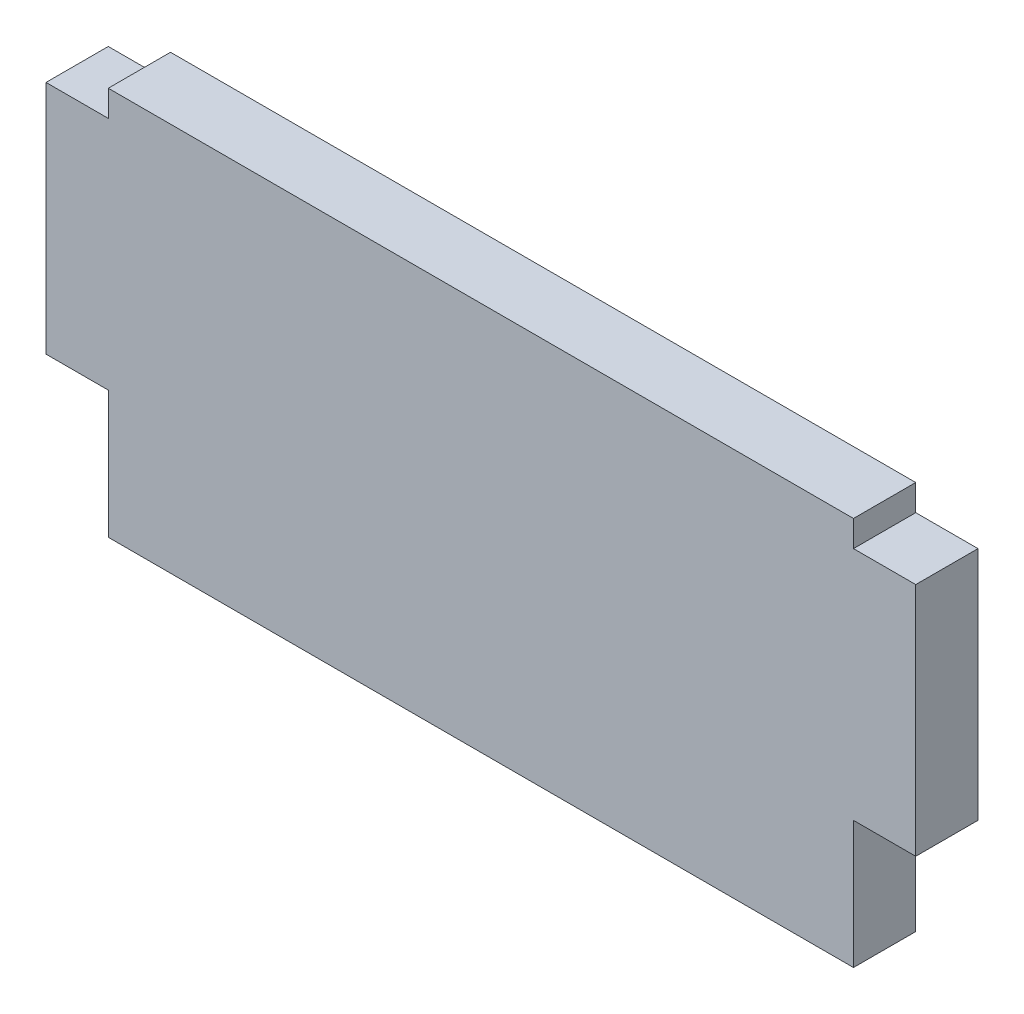
ISO-10303-21;
HEADER;
FILE_DESCRIPTION(('STEP AP214'),'2;1');
FILE_NAME('part.step','',(''),(''),'','','');
FILE_SCHEMA(('AUTOMOTIVE_DESIGN { 1 0 10303 214 1 1 1 1 }'));
ENDSEC;
DATA;
#1=APPLICATION_CONTEXT('core data for automotive mechanical design processes');
#2=APPLICATION_PROTOCOL_DEFINITION('international standard','automotive_design',2000,#1);
#3=PRODUCT_CONTEXT('',#1,'mechanical');
#4=PRODUCT('Part','Part','',(#3));
#5=PRODUCT_RELATED_PRODUCT_CATEGORY('part','',(#4));
#6=PRODUCT_DEFINITION_FORMATION('','',#4);
#7=PRODUCT_DEFINITION_CONTEXT('part definition',#1,'design');
#8=PRODUCT_DEFINITION('design','',#6,#7);
#9=PRODUCT_DEFINITION_SHAPE('','',#8);
#10=(LENGTH_UNIT() NAMED_UNIT(*) SI_UNIT(.MILLI.,.METRE.));
#11=(NAMED_UNIT(*) PLANE_ANGLE_UNIT() SI_UNIT($,.RADIAN.));
#12=(NAMED_UNIT(*) SI_UNIT($,.STERADIAN.) SOLID_ANGLE_UNIT());
#13=UNCERTAINTY_MEASURE_WITH_UNIT(LENGTH_MEASURE(1.E-05),#10,'distance_accuracy_value','');
#14=(GEOMETRIC_REPRESENTATION_CONTEXT(3) GLOBAL_UNCERTAINTY_ASSIGNED_CONTEXT((#13)) GLOBAL_UNIT_ASSIGNED_CONTEXT((#10,
#11,#12)) REPRESENTATION_CONTEXT('',''));
#15=CARTESIAN_POINT('',(0.,0.,0.));
#16=DIRECTION('',(0.,0.,1.));
#17=DIRECTION('',(1.,0.,0.));
#18=AXIS2_PLACEMENT_3D('',#15,#16,#17);
#19=CARTESIAN_POINT('',(-22.175,0.,3.175));
#20=DIRECTION('',(-1.,0.,0.));
#21=DIRECTION('',(0.,0.,1.));
#22=AXIS2_PLACEMENT_3D('',#19,#20,#21);
#23=PLANE('',#22);
#24=DIRECTION('',(0.,1.,0.));
#25=VECTOR('',#24,1.);
#26=CARTESIAN_POINT('',(-22.175,0.,3.175));
#27=LINE('',#26,#25);
#28=CARTESIAN_POINT('',(-22.175,-8.,3.175));
#29=VERTEX_POINT('',#28);
#30=CARTESIAN_POINT('',(-22.175,4.,3.175));
#31=VERTEX_POINT('',#30);
#32=EDGE_CURVE('E130',#29,#31,#27,.T.);
#33=ORIENTED_EDGE('',*,*,#32,.T.);
#34=DIRECTION('',(0.,0.,1.));
#35=VECTOR('',#34,1.);
#36=CARTESIAN_POINT('',(-22.175,4.,-6.825));
#37=LINE('',#36,#35);
#38=CARTESIAN_POINT('',(-22.175,4.,0.));
#39=VERTEX_POINT('',#38);
#40=EDGE_CURVE('E204',#39,#31,#37,.T.);
#41=ORIENTED_EDGE('',*,*,#40,.F.);
#42=DIRECTION('',(0.,1.,0.));
#43=VECTOR('',#42,1.);
#44=CARTESIAN_POINT('',(-22.175,0.,0.));
#45=LINE('',#44,#43);
#46=CARTESIAN_POINT('',(-22.175,-8.,0.));
#47=VERTEX_POINT('',#46);
#48=EDGE_CURVE('E160',#47,#39,#45,.T.);
#49=ORIENTED_EDGE('',*,*,#48,.F.);
#50=DIRECTION('',(0.,0.,-1.));
#51=VECTOR('',#50,1.);
#52=CARTESIAN_POINT('',(-22.175,-8.,3.175));
#53=LINE('',#52,#51);
#54=EDGE_CURVE('E83',#29,#47,#53,.T.);
#55=ORIENTED_EDGE('',*,*,#54,.F.);
#56=EDGE_LOOP('',(#33,#41,#49,#55));
#57=FACE_BOUND('',#56,.T.);
#58=ADVANCED_FACE('F39',(#57),#23,.T.);
#59=CARTESIAN_POINT('',(0.,0.,3.175));
#60=DIRECTION('',(0.,0.,1.));
#61=DIRECTION('',(1.,0.,0.));
#62=AXIS2_PLACEMENT_3D('',#59,#60,#61);
#63=PLANE('',#62);
#64=DIRECTION('',(-1.,0.,0.));
#65=VECTOR('',#64,1.);
#66=CARTESIAN_POINT('',(0.,-8.,3.175));
#67=LINE('',#66,#65);
#68=CARTESIAN_POINT('',(-19.,-8.,3.175));
#69=VERTEX_POINT('',#68);
#70=EDGE_CURVE('E144',#69,#29,#67,.T.);
#71=ORIENTED_EDGE('',*,*,#70,.F.);
#72=DIRECTION('',(0.,1.,0.));
#73=VECTOR('',#72,1.);
#74=CARTESIAN_POINT('',(-19.,0.,3.175));
#75=LINE('',#74,#73);
#76=CARTESIAN_POINT('',(-19.,-14.5,3.175));
#77=VERTEX_POINT('',#76);
#78=EDGE_CURVE('E56',#77,#69,#75,.T.);
#79=ORIENTED_EDGE('',*,*,#78,.F.);
#80=DIRECTION('',(1.,0.,0.));
#81=VECTOR('',#80,1.);
#82=CARTESIAN_POINT('',(19.,-14.5,3.175));
#83=LINE('',#82,#81);
#84=CARTESIAN_POINT('',(19.,-14.5,3.175));
#85=VERTEX_POINT('',#84);
#86=EDGE_CURVE('E203',#77,#85,#83,.T.);
#87=ORIENTED_EDGE('',*,*,#86,.T.);
#88=DIRECTION('',(0.,1.,0.));
#89=VECTOR('',#88,1.);
#90=CARTESIAN_POINT('',(19.,0.,3.175));
#91=LINE('',#90,#89);
#92=CARTESIAN_POINT('',(19.,-8.,3.175));
#93=VERTEX_POINT('',#92);
#94=EDGE_CURVE('E99',#85,#93,#91,.T.);
#95=ORIENTED_EDGE('',*,*,#94,.T.);
#96=DIRECTION('',(1.,0.,0.));
#97=VECTOR('',#96,1.);
#98=CARTESIAN_POINT('',(0.,-8.,3.175));
#99=LINE('',#98,#97);
#100=CARTESIAN_POINT('',(22.175,-8.,3.175));
#101=VERTEX_POINT('',#100);
#102=EDGE_CURVE('E138',#93,#101,#99,.T.);
#103=ORIENTED_EDGE('',*,*,#102,.T.);
#104=DIRECTION('',(0.,1.,0.));
#105=VECTOR('',#104,1.);
#106=CARTESIAN_POINT('',(22.175,0.,3.175));
#107=LINE('',#106,#105);
#108=CARTESIAN_POINT('',(22.175,4.,3.175));
#109=VERTEX_POINT('',#108);
#110=EDGE_CURVE('E135',#101,#109,#107,.T.);
#111=ORIENTED_EDGE('',*,*,#110,.T.);
#112=DIRECTION('',(1.,0.,0.));
#113=VECTOR('',#112,1.);
#114=CARTESIAN_POINT('',(0.,4.,3.175));
#115=LINE('',#114,#113);
#116=CARTESIAN_POINT('',(19.,4.,3.175));
#117=VERTEX_POINT('',#116);
#118=EDGE_CURVE('E115',#117,#109,#115,.T.);
#119=ORIENTED_EDGE('',*,*,#118,.F.);
#120=CARTESIAN_POINT('',(19.,5.33173076923077,3.175));
#121=VERTEX_POINT('',#120);
#122=EDGE_CURVE('E126',#117,#121,#91,.T.);
#123=ORIENTED_EDGE('',*,*,#122,.T.);
#124=DIRECTION('',(-1.,0.,0.));
#125=VECTOR('',#124,1.);
#126=CARTESIAN_POINT('',(0.,5.33173076923077,3.175));
#127=LINE('',#126,#125);
#128=CARTESIAN_POINT('',(-19.,5.33173076923077,3.175));
#129=VERTEX_POINT('',#128);
#130=EDGE_CURVE('E442',#121,#129,#127,.T.);
#131=ORIENTED_EDGE('',*,*,#130,.T.);
#132=DIRECTION('',(0.,-1.,0.));
#133=VECTOR('',#132,1.);
#134=CARTESIAN_POINT('',(-19.,0.,3.175));
#135=LINE('',#134,#133);
#136=CARTESIAN_POINT('',(-19.,4.,3.175));
#137=VERTEX_POINT('',#136);
#138=EDGE_CURVE('E441',#129,#137,#135,.T.);
#139=ORIENTED_EDGE('',*,*,#138,.T.);
#140=DIRECTION('',(-1.,0.,0.));
#141=VECTOR('',#140,1.);
#142=CARTESIAN_POINT('',(0.,4.,3.175));
#143=LINE('',#142,#141);
#144=EDGE_CURVE('E201',#137,#31,#143,.T.);
#145=ORIENTED_EDGE('',*,*,#144,.T.);
#146=ORIENTED_EDGE('',*,*,#32,.F.);
#147=EDGE_LOOP('',(#71,#79,#87,#95,#103,#111,#119,#123,#131,#139,#145,#146));
#148=FACE_BOUND('',#147,.T.);
#149=ADVANCED_FACE('F133',(#148),#63,.T.);
#150=CARTESIAN_POINT('',(0.,0.,0.));
#151=DIRECTION('',(0.,0.,1.));
#152=DIRECTION('',(1.,0.,0.));
#153=AXIS2_PLACEMENT_3D('',#150,#151,#152);
#154=PLANE('',#153);
#155=DIRECTION('',(0.,1.,0.));
#156=VECTOR('',#155,1.);
#157=CARTESIAN_POINT('',(-19.,0.,0.));
#158=LINE('',#157,#156);
#159=CARTESIAN_POINT('',(-19.,-14.5,0.));
#160=VERTEX_POINT('',#159);
#161=CARTESIAN_POINT('',(-19.,-8.,0.));
#162=VERTEX_POINT('',#161);
#163=EDGE_CURVE('E91',#160,#162,#158,.T.);
#164=ORIENTED_EDGE('',*,*,#163,.T.);
#165=DIRECTION('',(-1.,0.,0.));
#166=VECTOR('',#165,1.);
#167=CARTESIAN_POINT('',(0.,-8.,0.));
#168=LINE('',#167,#166);
#169=EDGE_CURVE('E159',#162,#47,#168,.T.);
#170=ORIENTED_EDGE('',*,*,#169,.T.);
#171=ORIENTED_EDGE('',*,*,#48,.T.);
#172=DIRECTION('',(-1.,0.,0.));
#173=VECTOR('',#172,1.);
#174=CARTESIAN_POINT('',(0.,4.,0.));
#175=LINE('',#174,#173);
#176=CARTESIAN_POINT('',(-19.,4.,0.));
#177=VERTEX_POINT('',#176);
#178=EDGE_CURVE('E11',#177,#39,#175,.T.);
#179=ORIENTED_EDGE('',*,*,#178,.F.);
#180=DIRECTION('',(0.,-1.,0.));
#181=VECTOR('',#180,1.);
#182=CARTESIAN_POINT('',(-19.,0.,0.));
#183=LINE('',#182,#181);
#184=CARTESIAN_POINT('',(-19.,5.33173076923077,0.));
#185=VERTEX_POINT('',#184);
#186=EDGE_CURVE('E48',#185,#177,#183,.T.);
#187=ORIENTED_EDGE('',*,*,#186,.F.);
#188=DIRECTION('',(-1.,0.,0.));
#189=VECTOR('',#188,1.);
#190=CARTESIAN_POINT('',(0.,5.33173076923077,0.));
#191=LINE('',#190,#189);
#192=CARTESIAN_POINT('',(19.,5.33173076923077,0.));
#193=VERTEX_POINT('',#192);
#194=EDGE_CURVE('E174',#193,#185,#191,.T.);
#195=ORIENTED_EDGE('',*,*,#194,.F.);
#196=DIRECTION('',(0.,1.,0.));
#197=VECTOR('',#196,1.);
#198=CARTESIAN_POINT('',(19.,0.,0.));
#199=LINE('',#198,#197);
#200=CARTESIAN_POINT('',(19.,4.,0.));
#201=VERTEX_POINT('',#200);
#202=EDGE_CURVE('E152',#201,#193,#199,.T.);
#203=ORIENTED_EDGE('',*,*,#202,.F.);
#204=DIRECTION('',(1.,0.,0.));
#205=VECTOR('',#204,1.);
#206=CARTESIAN_POINT('',(0.,4.,0.));
#207=LINE('',#206,#205);
#208=CARTESIAN_POINT('',(22.175,4.,0.));
#209=VERTEX_POINT('',#208);
#210=EDGE_CURVE('E117',#201,#209,#207,.T.);
#211=ORIENTED_EDGE('',*,*,#210,.T.);
#212=DIRECTION('',(0.,1.,0.));
#213=VECTOR('',#212,1.);
#214=CARTESIAN_POINT('',(22.175,0.,0.));
#215=LINE('',#214,#213);
#216=CARTESIAN_POINT('',(22.175,-8.,0.));
#217=VERTEX_POINT('',#216);
#218=EDGE_CURVE('E154',#217,#209,#215,.T.);
#219=ORIENTED_EDGE('',*,*,#218,.F.);
#220=DIRECTION('',(1.,0.,0.));
#221=VECTOR('',#220,1.);
#222=CARTESIAN_POINT('',(0.,-8.,0.));
#223=LINE('',#222,#221);
#224=CARTESIAN_POINT('',(19.,-8.,0.));
#225=VERTEX_POINT('',#224);
#226=EDGE_CURVE('E150',#225,#217,#223,.T.);
#227=ORIENTED_EDGE('',*,*,#226,.F.);
#228=CARTESIAN_POINT('',(19.,-14.5,0.));
#229=VERTEX_POINT('',#228);
#230=EDGE_CURVE('E148',#229,#225,#199,.T.);
#231=ORIENTED_EDGE('',*,*,#230,.F.);
#232=DIRECTION('',(-1.,0.,0.));
#233=VECTOR('',#232,1.);
#234=CARTESIAN_POINT('',(19.,-14.5,0.));
#235=LINE('',#234,#233);
#236=EDGE_CURVE('E151',#229,#160,#235,.T.);
#237=ORIENTED_EDGE('',*,*,#236,.T.);
#238=EDGE_LOOP('',(#164,#170,#171,#179,#187,#195,#203,#211,#219,#227,#231,#237));
#239=FACE_BOUND('',#238,.T.);
#240=ADVANCED_FACE('F206',(#239),#154,.F.);
#241=CARTESIAN_POINT('',(19.,0.,3.175));
#242=DIRECTION('',(-1.,0.,0.));
#243=DIRECTION('',(0.,0.,1.));
#244=AXIS2_PLACEMENT_3D('',#241,#242,#243);
#245=PLANE('',#244);
#246=ORIENTED_EDGE('',*,*,#230,.T.);
#247=DIRECTION('',(0.,0.,-1.));
#248=VECTOR('',#247,1.);
#249=CARTESIAN_POINT('',(19.,-8.,3.175));
#250=LINE('',#249,#248);
#251=EDGE_CURVE('E171',#93,#225,#250,.T.);
#252=ORIENTED_EDGE('',*,*,#251,.F.);
#253=ORIENTED_EDGE('',*,*,#94,.F.);
#254=DIRECTION('',(0.,0.,1.));
#255=VECTOR('',#254,1.);
#256=CARTESIAN_POINT('',(19.,-14.5,-32.7111983883196));
#257=LINE('',#256,#255);
#258=EDGE_CURVE('E216',#229,#85,#257,.T.);
#259=ORIENTED_EDGE('',*,*,#258,.F.);
#260=EDGE_LOOP('',(#246,#252,#253,#259));
#261=FACE_BOUND('',#260,.T.);
#262=ADVANCED_FACE('F243',(#261),#245,.F.);
#263=CARTESIAN_POINT('',(0.,-8.,3.175));
#264=DIRECTION('',(0.,1.,0.));
#265=DIRECTION('',(0.,0.,1.));
#266=AXIS2_PLACEMENT_3D('',#263,#264,#265);
#267=PLANE('',#266);
#268=ORIENTED_EDGE('',*,*,#226,.T.);
#269=DIRECTION('',(0.,0.,-1.));
#270=VECTOR('',#269,1.);
#271=CARTESIAN_POINT('',(22.175,-8.,3.175));
#272=LINE('',#271,#270);
#273=EDGE_CURVE('E168',#101,#217,#272,.T.);
#274=ORIENTED_EDGE('',*,*,#273,.F.);
#275=ORIENTED_EDGE('',*,*,#102,.F.);
#276=ORIENTED_EDGE('',*,*,#251,.T.);
#277=EDGE_LOOP('',(#268,#274,#275,#276));
#278=FACE_BOUND('',#277,.T.);
#279=ADVANCED_FACE('F41',(#278),#267,.F.);
#280=CARTESIAN_POINT('',(22.175,0.,3.175));
#281=DIRECTION('',(-1.,0.,0.));
#282=DIRECTION('',(0.,0.,1.));
#283=AXIS2_PLACEMENT_3D('',#280,#281,#282);
#284=PLANE('',#283);
#285=ORIENTED_EDGE('',*,*,#218,.T.);
#286=DIRECTION('',(0.,0.,-1.));
#287=VECTOR('',#286,1.);
#288=CARTESIAN_POINT('',(22.175,4.,3.175));
#289=LINE('',#288,#287);
#290=EDGE_CURVE('E121',#109,#209,#289,.T.);
#291=ORIENTED_EDGE('',*,*,#290,.F.);
#292=ORIENTED_EDGE('',*,*,#110,.F.);
#293=ORIENTED_EDGE('',*,*,#273,.T.);
#294=EDGE_LOOP('',(#285,#291,#292,#293));
#295=FACE_BOUND('',#294,.T.);
#296=ADVANCED_FACE('F225',(#295),#284,.F.);
#297=CARTESIAN_POINT('',(0.,4.,3.175));
#298=DIRECTION('',(0.,1.,0.));
#299=DIRECTION('',(0.,0.,1.));
#300=AXIS2_PLACEMENT_3D('',#297,#298,#299);
#301=PLANE('',#300);
#302=ORIENTED_EDGE('',*,*,#210,.F.);
#303=DIRECTION('',(0.,0.,-1.));
#304=VECTOR('',#303,1.);
#305=CARTESIAN_POINT('',(19.,4.,3.175));
#306=LINE('',#305,#304);
#307=EDGE_CURVE('E111',#117,#201,#306,.T.);
#308=ORIENTED_EDGE('',*,*,#307,.F.);
#309=ORIENTED_EDGE('',*,*,#118,.T.);
#310=ORIENTED_EDGE('',*,*,#290,.T.);
#311=EDGE_LOOP('',(#302,#308,#309,#310));
#312=FACE_BOUND('',#311,.T.);
#313=ADVANCED_FACE('F113',(#312),#301,.T.);
#314=ORIENTED_EDGE('',*,*,#202,.T.);
#315=DIRECTION('',(0.,0.,-1.));
#316=VECTOR('',#315,1.);
#317=CARTESIAN_POINT('',(19.,5.33173076923077,3.175));
#318=LINE('',#317,#316);
#319=EDGE_CURVE('E122',#121,#193,#318,.T.);
#320=ORIENTED_EDGE('',*,*,#319,.F.);
#321=ORIENTED_EDGE('',*,*,#122,.F.);
#322=ORIENTED_EDGE('',*,*,#307,.T.);
#323=EDGE_LOOP('',(#314,#320,#321,#322));
#324=FACE_BOUND('',#323,.T.);
#325=ADVANCED_FACE('F127',(#324),#245,.F.);
#326=CARTESIAN_POINT('',(0.,-8.,3.175));
#327=DIRECTION('',(0.,-1.,0.));
#328=DIRECTION('',(0.,0.,-1.));
#329=AXIS2_PLACEMENT_3D('',#326,#327,#328);
#330=PLANE('',#329);
#331=ORIENTED_EDGE('',*,*,#169,.F.);
#332=DIRECTION('',(0.,0.,-1.));
#333=VECTOR('',#332,1.);
#334=CARTESIAN_POINT('',(-19.,-8.,3.175));
#335=LINE('',#334,#333);
#336=EDGE_CURVE('E143',#69,#162,#335,.T.);
#337=ORIENTED_EDGE('',*,*,#336,.F.);
#338=ORIENTED_EDGE('',*,*,#70,.T.);
#339=ORIENTED_EDGE('',*,*,#54,.T.);
#340=EDGE_LOOP('',(#331,#337,#338,#339));
#341=FACE_BOUND('',#340,.T.);
#342=ADVANCED_FACE('F254',(#341),#330,.T.);
#343=CARTESIAN_POINT('',(-19.,0.,3.175));
#344=DIRECTION('',(-1.,0.,0.));
#345=DIRECTION('',(0.,0.,1.));
#346=AXIS2_PLACEMENT_3D('',#343,#344,#345);
#347=PLANE('',#346);
#348=ORIENTED_EDGE('',*,*,#78,.T.);
#349=ORIENTED_EDGE('',*,*,#336,.T.);
#350=ORIENTED_EDGE('',*,*,#163,.F.);
#351=DIRECTION('',(0.,0.,1.));
#352=VECTOR('',#351,1.);
#353=CARTESIAN_POINT('',(-19.,-14.5,-8.96863295246448));
#354=LINE('',#353,#352);
#355=EDGE_CURVE('E242',#160,#77,#354,.T.);
#356=ORIENTED_EDGE('',*,*,#355,.T.);
#357=EDGE_LOOP('',(#348,#349,#350,#356));
#358=FACE_BOUND('',#357,.T.);
#359=ADVANCED_FACE('F263',(#358),#347,.T.);
#360=CARTESIAN_POINT('',(19.,-14.5,-32.7111983883196));
#361=DIRECTION('',(0.,-1.,0.));
#362=DIRECTION('',(1.,0.,0.));
#363=AXIS2_PLACEMENT_3D('',#360,#361,#362);
#364=PLANE('',#363);
#365=ORIENTED_EDGE('',*,*,#258,.T.);
#366=ORIENTED_EDGE('',*,*,#86,.F.);
#367=ORIENTED_EDGE('',*,*,#355,.F.);
#368=ORIENTED_EDGE('',*,*,#236,.F.);
#369=EDGE_LOOP('',(#365,#366,#367,#368));
#370=FACE_BOUND('',#369,.T.);
#371=ADVANCED_FACE('F241',(#370),#364,.T.);
#372=CARTESIAN_POINT('',(-19.,0.,-6.825));
#373=DIRECTION('',(-1.,0.,0.));
#374=DIRECTION('',(0.,0.,1.));
#375=AXIS2_PLACEMENT_3D('',#372,#373,#374);
#376=PLANE('',#375);
#377=ORIENTED_EDGE('',*,*,#186,.T.);
#378=DIRECTION('',(0.,0.,1.));
#379=VECTOR('',#378,1.);
#380=CARTESIAN_POINT('',(-19.,4.,-6.825));
#381=LINE('',#380,#379);
#382=EDGE_CURVE('E186',#177,#137,#381,.T.);
#383=ORIENTED_EDGE('',*,*,#382,.T.);
#384=ORIENTED_EDGE('',*,*,#138,.F.);
#385=DIRECTION('',(0.,0.,1.));
#386=VECTOR('',#385,1.);
#387=CARTESIAN_POINT('',(-19.,5.33173076923077,-6.825));
#388=LINE('',#387,#386);
#389=EDGE_CURVE('E190',#185,#129,#388,.T.);
#390=ORIENTED_EDGE('',*,*,#389,.F.);
#391=EDGE_LOOP('',(#377,#383,#384,#390));
#392=FACE_BOUND('',#391,.T.);
#393=ADVANCED_FACE('F183',(#392),#376,.T.);
#394=CARTESIAN_POINT('',(0.,4.,-6.825));
#395=DIRECTION('',(0.,1.,0.));
#396=DIRECTION('',(-1.,0.,0.));
#397=AXIS2_PLACEMENT_3D('',#394,#395,#396);
#398=PLANE('',#397);
#399=ORIENTED_EDGE('',*,*,#178,.T.);
#400=ORIENTED_EDGE('',*,*,#40,.T.);
#401=ORIENTED_EDGE('',*,*,#144,.F.);
#402=ORIENTED_EDGE('',*,*,#382,.F.);
#403=EDGE_LOOP('',(#399,#400,#401,#402));
#404=FACE_BOUND('',#403,.T.);
#405=ADVANCED_FACE('F197',(#404),#398,.T.);
#406=CARTESIAN_POINT('',(0.,5.33173076923077,-6.825));
#407=DIRECTION('',(0.,1.,0.));
#408=DIRECTION('',(-1.,0.,0.));
#409=AXIS2_PLACEMENT_3D('',#406,#407,#408);
#410=PLANE('',#409);
#411=ORIENTED_EDGE('',*,*,#194,.T.);
#412=ORIENTED_EDGE('',*,*,#389,.T.);
#413=ORIENTED_EDGE('',*,*,#130,.F.);
#414=ORIENTED_EDGE('',*,*,#319,.T.);
#415=EDGE_LOOP('',(#411,#412,#413,#414));
#416=FACE_BOUND('',#415,.T.);
#417=ADVANCED_FACE('F227',(#416),#410,.T.);
#418=CLOSED_SHELL('',(#58,#149,#240,#262,#279,#296,#313,#325,#342,#359,#371,#393,#405,#417));
#419=MANIFOLD_SOLID_BREP('B2',#418);
#420=ADVANCED_BREP_SHAPE_REPRESENTATION('',(#18,#419),#14);
#421=SHAPE_DEFINITION_REPRESENTATION(#9,#420);
ENDSEC;
END-ISO-10303-21;
